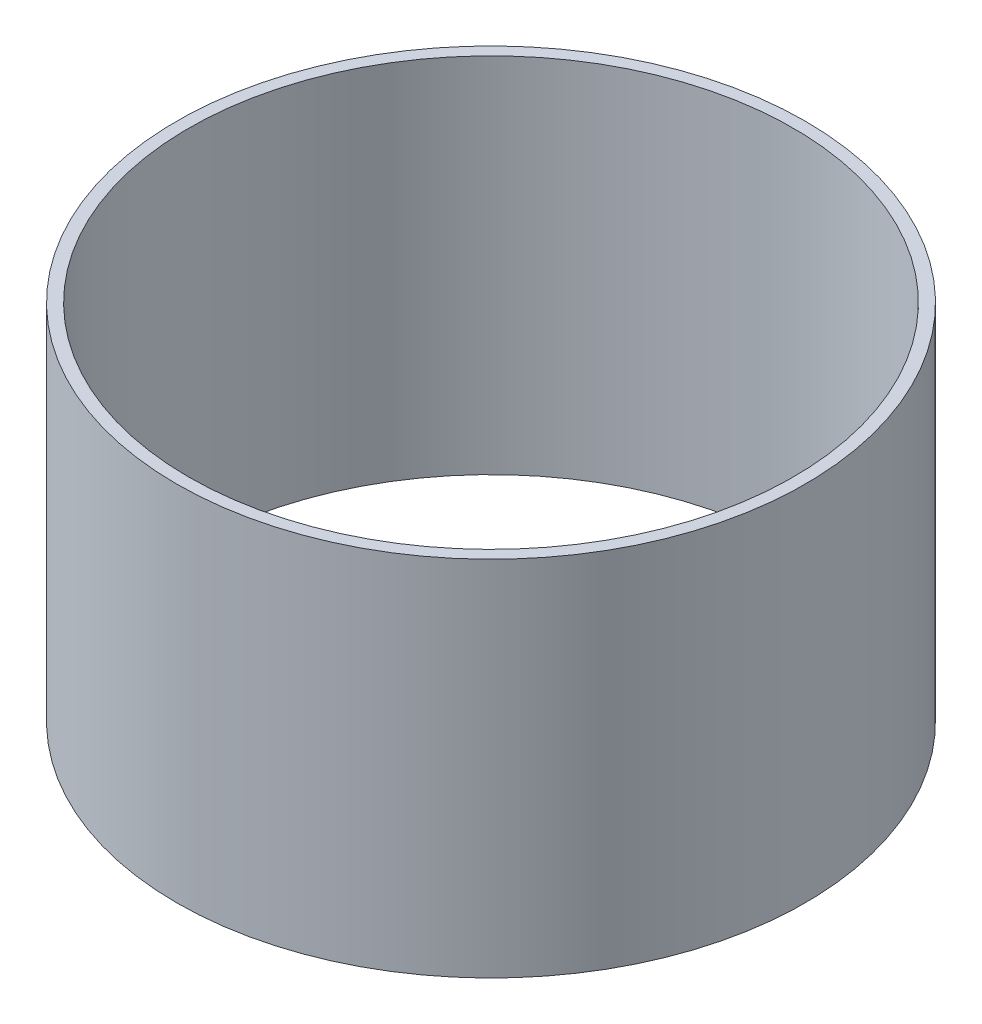
ISO-10303-21;
HEADER;
FILE_DESCRIPTION(('STEP AP214'),'2;1');
FILE_NAME('part.step','',(''),(''),'','','');
FILE_SCHEMA(('AUTOMOTIVE_DESIGN { 1 0 10303 214 1 1 1 1 }'));
ENDSEC;
DATA;
#1=APPLICATION_CONTEXT('core data for automotive mechanical design processes');
#2=APPLICATION_PROTOCOL_DEFINITION('international standard','automotive_design',2000,#1);
#3=PRODUCT_CONTEXT('',#1,'mechanical');
#4=PRODUCT('Part','Part','',(#3));
#5=PRODUCT_RELATED_PRODUCT_CATEGORY('part','',(#4));
#6=PRODUCT_DEFINITION_FORMATION('','',#4);
#7=PRODUCT_DEFINITION_CONTEXT('part definition',#1,'design');
#8=PRODUCT_DEFINITION('design','',#6,#7);
#9=PRODUCT_DEFINITION_SHAPE('','',#8);
#10=(LENGTH_UNIT() NAMED_UNIT(*) SI_UNIT(.MILLI.,.METRE.));
#11=(NAMED_UNIT(*) PLANE_ANGLE_UNIT() SI_UNIT($,.RADIAN.));
#12=(NAMED_UNIT(*) SI_UNIT($,.STERADIAN.) SOLID_ANGLE_UNIT());
#13=UNCERTAINTY_MEASURE_WITH_UNIT(LENGTH_MEASURE(1.E-05),#10,'distance_accuracy_value','');
#14=(GEOMETRIC_REPRESENTATION_CONTEXT(3) GLOBAL_UNCERTAINTY_ASSIGNED_CONTEXT((#13)) GLOBAL_UNIT_ASSIGNED_CONTEXT((#10,
#11,#12)) REPRESENTATION_CONTEXT('',''));
#15=CARTESIAN_POINT('',(0.,0.,0.));
#16=DIRECTION('',(0.,0.,1.));
#17=DIRECTION('',(1.,0.,0.));
#18=AXIS2_PLACEMENT_3D('',#15,#16,#17);
#19=CARTESIAN_POINT('',(0.,30.,0.));
#20=DIRECTION('',(0.,1.,0.));
#21=DIRECTION('',(0.,0.,1.));
#22=AXIS2_PLACEMENT_3D('',#19,#20,#21);
#23=PLANE('',#22);
#24=CARTESIAN_POINT('',(0.,30.,0.));
#25=DIRECTION('',(0.,1.,0.));
#26=DIRECTION('',(0.,0.,1.));
#27=AXIS2_PLACEMENT_3D('',#24,#25,#26);
#28=CIRCLE('',#27,26.);
#29=CARTESIAN_POINT('',(0.,30.,26.));
#30=VERTEX_POINT('',#29);
#31=EDGE_CURVE('E10',#30,#30,#28,.T.);
#32=ORIENTED_EDGE('',*,*,#31,.T.);
#33=EDGE_LOOP('',(#32));
#34=FACE_BOUND('',#33,.T.);
#35=CARTESIAN_POINT('',(0.,30.,0.));
#36=DIRECTION('',(0.,1.,0.));
#37=DIRECTION('',(0.,0.,1.));
#38=AXIS2_PLACEMENT_3D('',#35,#36,#37);
#39=CIRCLE('',#38,25.);
#40=CARTESIAN_POINT('',(0.,30.,25.));
#41=VERTEX_POINT('',#40);
#42=EDGE_CURVE('E50',#41,#41,#39,.T.);
#43=ORIENTED_EDGE('',*,*,#42,.F.);
#44=EDGE_LOOP('',(#43));
#45=FACE_BOUND('',#44,.T.);
#46=ADVANCED_FACE('F37',(#34,#45),#23,.T.);
#47=CARTESIAN_POINT('',(0.,0.,0.));
#48=DIRECTION('',(0.,1.,0.));
#49=DIRECTION('',(0.,0.,1.));
#50=AXIS2_PLACEMENT_3D('',#47,#48,#49);
#51=PLANE('',#50);
#52=CARTESIAN_POINT('',(0.,0.,0.));
#53=DIRECTION('',(0.,1.,0.));
#54=DIRECTION('',(0.,0.,1.));
#55=AXIS2_PLACEMENT_3D('',#52,#53,#54);
#56=CIRCLE('',#55,26.);
#57=CARTESIAN_POINT('',(0.,0.,26.));
#58=VERTEX_POINT('',#57);
#59=EDGE_CURVE('E41',#58,#58,#56,.T.);
#60=ORIENTED_EDGE('',*,*,#59,.F.);
#61=EDGE_LOOP('',(#60));
#62=FACE_BOUND('',#61,.T.);
#63=CARTESIAN_POINT('',(0.,0.,0.));
#64=DIRECTION('',(0.,1.,0.));
#65=DIRECTION('',(0.,0.,1.));
#66=AXIS2_PLACEMENT_3D('',#63,#64,#65);
#67=CIRCLE('',#66,25.);
#68=CARTESIAN_POINT('',(0.,0.,25.));
#69=VERTEX_POINT('',#68);
#70=EDGE_CURVE('E52',#69,#69,#67,.T.);
#71=ORIENTED_EDGE('',*,*,#70,.T.);
#72=EDGE_LOOP('',(#71));
#73=FACE_BOUND('',#72,.T.);
#74=ADVANCED_FACE('F64',(#62,#73),#51,.F.);
#75=CARTESIAN_POINT('',(0.,30.,0.));
#76=DIRECTION('',(0.,-1.,0.));
#77=DIRECTION('',(0.,0.,-1.));
#78=AXIS2_PLACEMENT_3D('',#75,#76,#77);
#79=CYLINDRICAL_SURFACE('',#78,26.);
#80=ORIENTED_EDGE('',*,*,#31,.F.);
#81=EDGE_LOOP('',(#80));
#82=FACE_BOUND('',#81,.T.);
#83=ORIENTED_EDGE('',*,*,#59,.T.);
#84=EDGE_LOOP('',(#83));
#85=FACE_BOUND('',#84,.T.);
#86=ADVANCED_FACE('F39',(#82,#85),#79,.T.);
#87=CARTESIAN_POINT('',(0.,30.,0.));
#88=DIRECTION('',(0.,-1.,0.));
#89=DIRECTION('',(0.,0.,-1.));
#90=AXIS2_PLACEMENT_3D('',#87,#88,#89);
#91=CYLINDRICAL_SURFACE('',#90,25.);
#92=ORIENTED_EDGE('',*,*,#42,.T.);
#93=EDGE_LOOP('',(#92));
#94=FACE_BOUND('',#93,.T.);
#95=ORIENTED_EDGE('',*,*,#70,.F.);
#96=EDGE_LOOP('',(#95));
#97=FACE_BOUND('',#96,.T.);
#98=ADVANCED_FACE('F60',(#94,#97),#91,.F.);
#99=CLOSED_SHELL('',(#46,#74,#86,#98));
#100=MANIFOLD_SOLID_BREP('B2',#99);
#101=ADVANCED_BREP_SHAPE_REPRESENTATION('',(#18,#100),#14);
#102=SHAPE_DEFINITION_REPRESENTATION(#9,#101);
ENDSEC;
END-ISO-10303-21;
